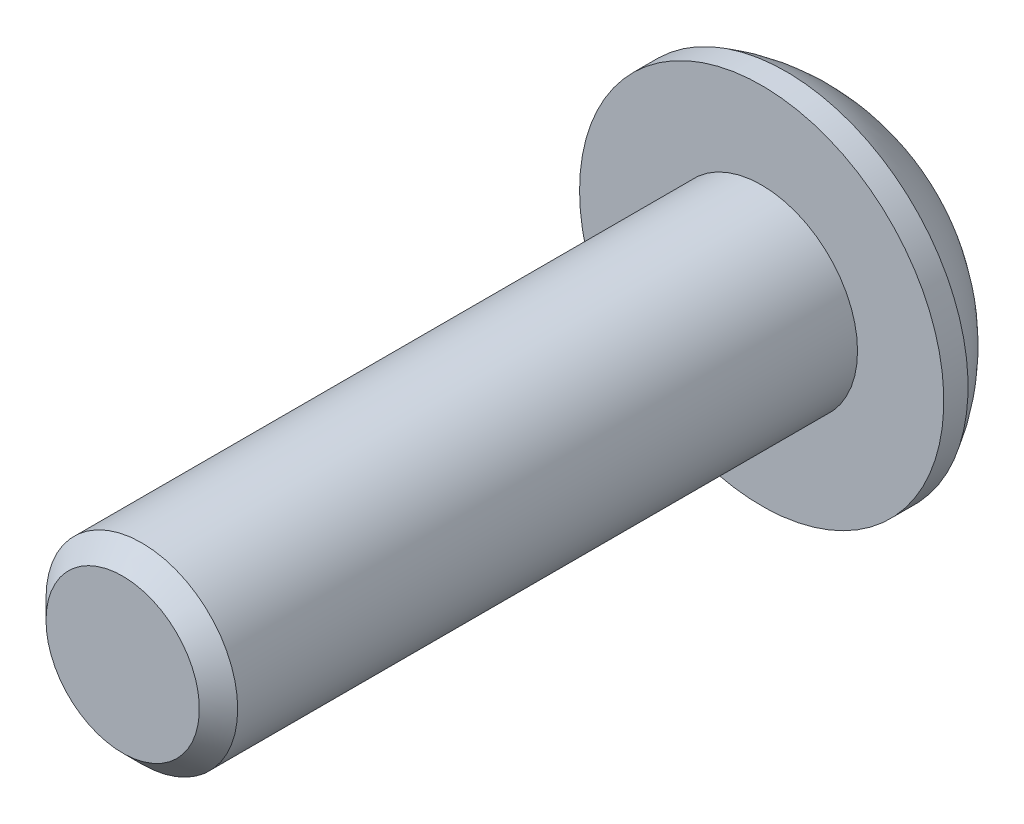
ISO-10303-21;
HEADER;
FILE_DESCRIPTION(('STEP AP214'),'2;1');
FILE_NAME('part.step','',(''),(''),'','','');
FILE_SCHEMA(('AUTOMOTIVE_DESIGN { 1 0 10303 214 1 1 1 1 }'));
ENDSEC;
DATA;
#1=APPLICATION_CONTEXT('core data for automotive mechanical design processes');
#2=APPLICATION_PROTOCOL_DEFINITION('international standard','automotive_design',2000,#1);
#3=PRODUCT_CONTEXT('',#1,'mechanical');
#4=PRODUCT('Part','Part','',(#3));
#5=PRODUCT_RELATED_PRODUCT_CATEGORY('part','',(#4));
#6=PRODUCT_DEFINITION_FORMATION('','',#4);
#7=PRODUCT_DEFINITION_CONTEXT('part definition',#1,'design');
#8=PRODUCT_DEFINITION('design','',#6,#7);
#9=PRODUCT_DEFINITION_SHAPE('','',#8);
#10=(LENGTH_UNIT() NAMED_UNIT(*) SI_UNIT(.MILLI.,.METRE.));
#11=(NAMED_UNIT(*) PLANE_ANGLE_UNIT() SI_UNIT($,.RADIAN.));
#12=(NAMED_UNIT(*) SI_UNIT($,.STERADIAN.) SOLID_ANGLE_UNIT());
#13=UNCERTAINTY_MEASURE_WITH_UNIT(LENGTH_MEASURE(1.E-05),#10,'distance_accuracy_value','');
#14=(GEOMETRIC_REPRESENTATION_CONTEXT(3) GLOBAL_UNCERTAINTY_ASSIGNED_CONTEXT((#13)) GLOBAL_UNIT_ASSIGNED_CONTEXT((#10,
#11,#12)) REPRESENTATION_CONTEXT('',''));
#15=CARTESIAN_POINT('',(0.,0.,0.));
#16=DIRECTION('',(0.,0.,1.));
#17=DIRECTION('',(1.,0.,0.));
#18=AXIS2_PLACEMENT_3D('',#15,#16,#17);
#19=CARTESIAN_POINT('',(0.,0.,-0.84));
#20=DIRECTION('',(0.,0.,1.));
#21=DIRECTION('',(1.,0.,0.));
#22=AXIS2_PLACEMENT_3D('',#19,#20,#21);
#23=PLANE('',#22);
#24=DIRECTION('',(-0.866025403784439,0.5,0.));
#25=VECTOR('',#24,1.);
#26=CARTESIAN_POINT('',(0.,1.15470053837925,-0.84));
#27=LINE('',#26,#25);
#28=CARTESIAN_POINT('',(0.,1.15470053837925,-0.84));
#29=VERTEX_POINT('',#28);
#30=CARTESIAN_POINT('',(1.,0.577350269189626,-0.84));
#31=VERTEX_POINT('',#30);
#32=EDGE_CURVE('E156',#29,#31,#27,.F.);
#33=ORIENTED_EDGE('',*,*,#32,.T.);
#34=DIRECTION('',(0.,1.,0.));
#35=VECTOR('',#34,1.);
#36=CARTESIAN_POINT('',(1.,0.577350269189626,-0.84));
#37=LINE('',#36,#35);
#38=CARTESIAN_POINT('',(1.,-0.577350269189626,-0.84));
#39=VERTEX_POINT('',#38);
#40=EDGE_CURVE('E68',#31,#39,#37,.F.);
#41=ORIENTED_EDGE('',*,*,#40,.T.);
#42=DIRECTION('',(0.866025403784439,0.499999999999999,0.));
#43=VECTOR('',#42,1.);
#44=CARTESIAN_POINT('',(1.,-0.577350269189626,-0.84));
#45=LINE('',#44,#43);
#46=CARTESIAN_POINT('',(0.,-1.15470053837925,-0.84));
#47=VERTEX_POINT('',#46);
#48=EDGE_CURVE('E70',#39,#47,#45,.F.);
#49=ORIENTED_EDGE('',*,*,#48,.T.);
#50=DIRECTION('',(0.866025403784438,-0.5,0.));
#51=VECTOR('',#50,1.);
#52=CARTESIAN_POINT('',(0.,-1.15470053837925,-0.84));
#53=LINE('',#52,#51);
#54=CARTESIAN_POINT('',(-1.,-0.577350269189625,-0.84));
#55=VERTEX_POINT('',#54);
#56=EDGE_CURVE('E72',#47,#55,#53,.F.);
#57=ORIENTED_EDGE('',*,*,#56,.T.);
#58=DIRECTION('',(0.,1.,0.));
#59=VECTOR('',#58,1.);
#60=CARTESIAN_POINT('',(-1.,-0.577350269189626,-0.84));
#61=LINE('',#60,#59);
#62=CARTESIAN_POINT('',(-1.,0.577350269189626,-0.84));
#63=VERTEX_POINT('',#62);
#64=EDGE_CURVE('E144',#55,#63,#61,.T.);
#65=ORIENTED_EDGE('',*,*,#64,.T.);
#66=DIRECTION('',(-0.866025403784439,-0.5,0.));
#67=VECTOR('',#66,1.);
#68=CARTESIAN_POINT('',(-1.,0.577350269189626,-0.84));
#69=LINE('',#68,#67);
#70=EDGE_CURVE('E151',#63,#29,#69,.F.);
#71=ORIENTED_EDGE('',*,*,#70,.T.);
#72=EDGE_LOOP('',(#33,#41,#49,#57,#65,#71));
#73=FACE_BOUND('',#72,.T.);
#74=ADVANCED_FACE('F16',(#73),#23,.F.);
#75=CARTESIAN_POINT('',(0.,-1.15470053837925,-1.65));
#76=DIRECTION('',(-0.5,-0.866025403784438,0.));
#77=DIRECTION('',(0.866025403784438,-0.5,0.));
#78=AXIS2_PLACEMENT_3D('',#75,#76,#77);
#79=PLANE('',#78);
#80=ORIENTED_EDGE('',*,*,#56,.F.);
#81=DIRECTION('',(0.,0.,1.));
#82=VECTOR('',#81,1.);
#83=CARTESIAN_POINT('',(0.,-1.15470053837925,-1.65));
#84=LINE('',#83,#82);
#85=CARTESIAN_POINT('',(0.,-1.15470053837925,-1.65));
#86=VERTEX_POINT('',#85);
#87=EDGE_CURVE('E78',#47,#86,#84,.F.);
#88=ORIENTED_EDGE('',*,*,#87,.T.);
#89=DIRECTION('',(0.866025403784439,-0.499999999999999,0.));
#90=VECTOR('',#89,1.);
#91=CARTESIAN_POINT('',(-1.,-0.577350269189626,-1.65));
#92=LINE('',#91,#90);
#93=CARTESIAN_POINT('',(-1.,-0.577350269189625,-1.65));
#94=VERTEX_POINT('',#93);
#95=EDGE_CURVE('E139',#94,#86,#92,.T.);
#96=ORIENTED_EDGE('',*,*,#95,.F.);
#97=DIRECTION('',(0.,0.,1.));
#98=VECTOR('',#97,1.);
#99=CARTESIAN_POINT('',(-1.,-0.577350269189626,-1.65));
#100=LINE('',#99,#98);
#101=EDGE_CURVE('E84',#94,#55,#100,.T.);
#102=ORIENTED_EDGE('',*,*,#101,.T.);
#103=EDGE_LOOP('',(#80,#88,#96,#102));
#104=FACE_BOUND('',#103,.T.);
#105=ADVANCED_FACE('F81',(#104),#79,.F.);
#106=CARTESIAN_POINT('',(1.,-0.577350269189626,-1.65));
#107=DIRECTION('',(0.499999999999999,-0.866025403784439,0.));
#108=DIRECTION('',(0.866025403784439,0.499999999999999,0.));
#109=AXIS2_PLACEMENT_3D('',#106,#107,#108);
#110=PLANE('',#109);
#111=ORIENTED_EDGE('',*,*,#48,.F.);
#112=DIRECTION('',(0.,0.,-1.));
#113=VECTOR('',#112,1.);
#114=CARTESIAN_POINT('',(1.,-0.577350269189626,-1.65));
#115=LINE('',#114,#113);
#116=CARTESIAN_POINT('',(1.,-0.577350269189626,-1.65));
#117=VERTEX_POINT('',#116);
#118=EDGE_CURVE('E98',#39,#117,#115,.T.);
#119=ORIENTED_EDGE('',*,*,#118,.T.);
#120=DIRECTION('',(0.866025403784439,0.499999999999998,0.));
#121=VECTOR('',#120,1.);
#122=CARTESIAN_POINT('',(0.,-1.15470053837925,-1.65));
#123=LINE('',#122,#121);
#124=EDGE_CURVE('E90',#86,#117,#123,.T.);
#125=ORIENTED_EDGE('',*,*,#124,.F.);
#126=ORIENTED_EDGE('',*,*,#87,.F.);
#127=EDGE_LOOP('',(#111,#119,#125,#126));
#128=FACE_BOUND('',#127,.T.);
#129=ADVANCED_FACE('F88',(#128),#110,.F.);
#130=CARTESIAN_POINT('',(1.,0.577350269189626,-1.65));
#131=DIRECTION('',(1.,0.,0.));
#132=DIRECTION('',(0.,0.,-1.));
#133=AXIS2_PLACEMENT_3D('',#130,#131,#132);
#134=PLANE('',#133);
#135=ORIENTED_EDGE('',*,*,#40,.F.);
#136=DIRECTION('',(0.,0.,1.));
#137=VECTOR('',#136,1.);
#138=CARTESIAN_POINT('',(1.,0.577350269189625,-1.65));
#139=LINE('',#138,#137);
#140=CARTESIAN_POINT('',(1.,0.577350269189626,-1.65));
#141=VERTEX_POINT('',#140);
#142=EDGE_CURVE('E154',#31,#141,#139,.F.);
#143=ORIENTED_EDGE('',*,*,#142,.T.);
#144=DIRECTION('',(0.,1.,0.));
#145=VECTOR('',#144,1.);
#146=CARTESIAN_POINT('',(1.,-0.7125,-1.65));
#147=LINE('',#146,#145);
#148=EDGE_CURVE('E133',#117,#141,#147,.T.);
#149=ORIENTED_EDGE('',*,*,#148,.F.);
#150=ORIENTED_EDGE('',*,*,#118,.F.);
#151=EDGE_LOOP('',(#135,#143,#149,#150));
#152=FACE_BOUND('',#151,.T.);
#153=ADVANCED_FACE('F160',(#152),#134,.F.);
#154=CARTESIAN_POINT('',(0.,1.15470053837925,-1.65));
#155=DIRECTION('',(0.5,0.866025403784439,0.));
#156=DIRECTION('',(-0.866025403784439,0.5,0.));
#157=AXIS2_PLACEMENT_3D('',#154,#155,#156);
#158=PLANE('',#157);
#159=ORIENTED_EDGE('',*,*,#32,.F.);
#160=DIRECTION('',(0.,0.,1.));
#161=VECTOR('',#160,1.);
#162=CARTESIAN_POINT('',(0.,1.15470053837925,-1.65));
#163=LINE('',#162,#161);
#164=CARTESIAN_POINT('',(0.,1.15470053837925,-1.65));
#165=VERTEX_POINT('',#164);
#166=EDGE_CURVE('E148',#29,#165,#163,.F.);
#167=ORIENTED_EDGE('',*,*,#166,.T.);
#168=DIRECTION('',(-0.866025403784439,0.499999999999999,0.));
#169=VECTOR('',#168,1.);
#170=CARTESIAN_POINT('',(1.,0.577350269189626,-1.65));
#171=LINE('',#170,#169);
#172=EDGE_CURVE('E129',#141,#165,#171,.T.);
#173=ORIENTED_EDGE('',*,*,#172,.F.);
#174=ORIENTED_EDGE('',*,*,#142,.F.);
#175=EDGE_LOOP('',(#159,#167,#173,#174));
#176=FACE_BOUND('',#175,.T.);
#177=ADVANCED_FACE('F172',(#176),#158,.F.);
#178=CARTESIAN_POINT('',(-1.,0.577350269189626,-1.65));
#179=DIRECTION('',(-0.5,0.866025403784439,0.));
#180=DIRECTION('',(-0.866025403784439,-0.5,0.));
#181=AXIS2_PLACEMENT_3D('',#178,#179,#180);
#182=PLANE('',#181);
#183=ORIENTED_EDGE('',*,*,#70,.F.);
#184=DIRECTION('',(0.,0.,1.));
#185=VECTOR('',#184,1.);
#186=CARTESIAN_POINT('',(-1.,0.577350269189626,-1.65));
#187=LINE('',#186,#185);
#188=CARTESIAN_POINT('',(-1.,0.577350269189626,-1.65));
#189=VERTEX_POINT('',#188);
#190=EDGE_CURVE('E35',#63,#189,#187,.F.);
#191=ORIENTED_EDGE('',*,*,#190,.T.);
#192=DIRECTION('',(-0.866025403784439,-0.499999999999999,0.));
#193=VECTOR('',#192,1.);
#194=CARTESIAN_POINT('',(0.,1.15470053837925,-1.65));
#195=LINE('',#194,#193);
#196=EDGE_CURVE('E125',#165,#189,#195,.T.);
#197=ORIENTED_EDGE('',*,*,#196,.F.);
#198=ORIENTED_EDGE('',*,*,#166,.F.);
#199=EDGE_LOOP('',(#183,#191,#197,#198));
#200=FACE_BOUND('',#199,.T.);
#201=ADVANCED_FACE('F170',(#200),#182,.F.);
#202=CARTESIAN_POINT('',(-1.,-0.577350269189626,-1.65));
#203=DIRECTION('',(-1.,0.,0.));
#204=DIRECTION('',(0.,0.,1.));
#205=AXIS2_PLACEMENT_3D('',#202,#203,#204);
#206=PLANE('',#205);
#207=ORIENTED_EDGE('',*,*,#64,.F.);
#208=ORIENTED_EDGE('',*,*,#101,.F.);
#209=DIRECTION('',(0.,1.,0.));
#210=VECTOR('',#209,1.);
#211=CARTESIAN_POINT('',(-1.,-0.7125,-1.65));
#212=LINE('',#211,#210);
#213=EDGE_CURVE('E119',#189,#94,#212,.F.);
#214=ORIENTED_EDGE('',*,*,#213,.F.);
#215=ORIENTED_EDGE('',*,*,#190,.F.);
#216=EDGE_LOOP('',(#207,#208,#214,#215));
#217=FACE_BOUND('',#216,.T.);
#218=ADVANCED_FACE('F167',(#217),#206,.F.);
#219=CARTESIAN_POINT('',(0.,-0.7125,-1.65));
#220=DIRECTION('',(0.,0.,-1.));
#221=DIRECTION('',(-1.,0.,0.));
#222=AXIS2_PLACEMENT_3D('',#219,#220,#221);
#223=PLANE('',#222);
#224=ORIENTED_EDGE('',*,*,#196,.T.);
#225=ORIENTED_EDGE('',*,*,#213,.T.);
#226=ORIENTED_EDGE('',*,*,#95,.T.);
#227=ORIENTED_EDGE('',*,*,#124,.T.);
#228=ORIENTED_EDGE('',*,*,#148,.T.);
#229=ORIENTED_EDGE('',*,*,#172,.T.);
#230=EDGE_LOOP('',(#224,#225,#226,#227,#228,#229));
#231=FACE_BOUND('',#230,.T.);
#232=CARTESIAN_POINT('',(0.,0.,-1.65));
#233=DIRECTION('',(0.,0.,-1.));
#234=DIRECTION('',(-1.,0.,0.));
#235=AXIS2_PLACEMENT_3D('',#232,#233,#234);
#236=CIRCLE('',#235,1.425);
#237=CARTESIAN_POINT('',(-1.425,0.,-1.65));
#238=VERTEX_POINT('',#237);
#239=EDGE_CURVE('E19',#238,#238,#236,.F.);
#240=ORIENTED_EDGE('',*,*,#239,.F.);
#241=EDGE_LOOP('',(#240));
#242=FACE_BOUND('',#241,.T.);
#243=ADVANCED_FACE('F164',(#231,#242),#223,.T.);
#244=CARTESIAN_POINT('',(0.,0.,1.02727559055118));
#245=DIRECTION('',(0.,0.,-1.));
#246=DIRECTION('',(0.,-1.,0.));
#247=AXIS2_PLACEMENT_3D('',#244,#245,#246);
#248=DEGENERATE_TOROIDAL_SURFACE('',#247,0.317366666666667,2.89735330756749,.T.);
#249=CARTESIAN_POINT('',(0.,0.,-0.380000000000001));
#250=DIRECTION('',(0.,0.,-1.));
#251=DIRECTION('',(-1.,0.,0.));
#252=AXIS2_PLACEMENT_3D('',#249,#250,#251);
#253=CIRCLE('',#252,2.85);
#254=CARTESIAN_POINT('',(-2.85,0.,-0.380000000000001));
#255=VERTEX_POINT('',#254);
#256=EDGE_CURVE('E108',#255,#255,#253,.F.);
#257=ORIENTED_EDGE('',*,*,#256,.F.);
#258=EDGE_LOOP('',(#257));
#259=FACE_BOUND('',#258,.T.);
#260=ORIENTED_EDGE('',*,*,#239,.T.);
#261=EDGE_LOOP('',(#260));
#262=FACE_BOUND('',#261,.T.);
#263=ADVANCED_FACE('F203',(#259,#262),#248,.T.);
#264=CARTESIAN_POINT('',(0.,0.,10.));
#265=DIRECTION('',(0.,0.,1.));
#266=DIRECTION('',(1.,0.,0.));
#267=AXIS2_PLACEMENT_3D('',#264,#265,#266);
#268=PLANE('',#267);
#269=CARTESIAN_POINT('',(0.,0.,9.99999999999091));
#270=DIRECTION('',(0.,0.,-1.));
#271=DIRECTION('',(-1.,0.,0.));
#272=AXIS2_PLACEMENT_3D('',#269,#270,#271);
#273=CIRCLE('',#272,1.19999999998299);
#274=CARTESIAN_POINT('',(-1.19999999998299,0.,9.99999999999091));
#275=VERTEX_POINT('',#274);
#276=EDGE_CURVE('E105',#275,#275,#273,.T.);
#277=ORIENTED_EDGE('',*,*,#276,.F.);
#278=EDGE_LOOP('',(#277));
#279=FACE_BOUND('',#278,.T.);
#280=ADVANCED_FACE('F199',(#279),#268,.T.);
#281=CARTESIAN_POINT('',(0.,0.,-0.19));
#282=DIRECTION('',(0.,0.,-1.));
#283=DIRECTION('',(-1.,0.,0.));
#284=AXIS2_PLACEMENT_3D('',#281,#282,#283);
#285=CYLINDRICAL_SURFACE('',#284,2.85);
#286=CARTESIAN_POINT('',(0.,0.,0.));
#287=DIRECTION('',(0.,0.,-1.));
#288=DIRECTION('',(-1.,0.,0.));
#289=AXIS2_PLACEMENT_3D('',#286,#287,#288);
#290=CIRCLE('',#289,2.85);
#291=CARTESIAN_POINT('',(-2.85,0.,0.));
#292=VERTEX_POINT('',#291);
#293=EDGE_CURVE('E102',#292,#292,#290,.T.);
#294=ORIENTED_EDGE('',*,*,#293,.T.);
#295=EDGE_LOOP('',(#294));
#296=FACE_BOUND('',#295,.T.);
#297=ORIENTED_EDGE('',*,*,#256,.T.);
#298=EDGE_LOOP('',(#297));
#299=FACE_BOUND('',#298,.T.);
#300=ADVANCED_FACE('F195',(#296,#299),#285,.T.);
#301=CARTESIAN_POINT('',(0.,0.,9.70000000000937));
#302=DIRECTION('',(0.,0.,-1.));
#303=DIRECTION('',(-1.,0.,0.));
#304=AXIS2_PLACEMENT_3D('',#301,#302,#303);
#305=CONICAL_SURFACE('',#304,1.49999999996453,0.785398163397448);
#306=CARTESIAN_POINT('',(0.,0.,9.7));
#307=DIRECTION('',(0.,0.,1.));
#308=DIRECTION('',(1.,0.,0.));
#309=AXIS2_PLACEMENT_3D('',#306,#307,#308);
#310=CIRCLE('',#309,1.5);
#311=CARTESIAN_POINT('',(1.5,0.,9.7));
#312=VERTEX_POINT('',#311);
#313=EDGE_CURVE('E26',#312,#312,#310,.F.);
#314=ORIENTED_EDGE('',*,*,#313,.F.);
#315=EDGE_LOOP('',(#314));
#316=FACE_BOUND('',#315,.T.);
#317=ORIENTED_EDGE('',*,*,#276,.T.);
#318=EDGE_LOOP('',(#317));
#319=FACE_BOUND('',#318,.T.);
#320=ADVANCED_FACE('F188',(#316,#319),#305,.T.);
#321=CARTESIAN_POINT('',(0.,-1.425,0.));
#322=DIRECTION('',(0.,0.,-1.));
#323=DIRECTION('',(-1.,0.,0.));
#324=AXIS2_PLACEMENT_3D('',#321,#322,#323);
#325=PLANE('',#324);
#326=CARTESIAN_POINT('',(0.,0.,0.));
#327=DIRECTION('',(0.,0.,1.));
#328=DIRECTION('',(1.,0.,0.));
#329=AXIS2_PLACEMENT_3D('',#326,#327,#328);
#330=CIRCLE('',#329,1.5);
#331=CARTESIAN_POINT('',(1.5,0.,0.));
#332=VERTEX_POINT('',#331);
#333=EDGE_CURVE('E11',#332,#332,#330,.T.);
#334=ORIENTED_EDGE('',*,*,#333,.F.);
#335=EDGE_LOOP('',(#334));
#336=FACE_BOUND('',#335,.T.);
#337=ORIENTED_EDGE('',*,*,#293,.F.);
#338=EDGE_LOOP('',(#337));
#339=FACE_BOUND('',#338,.T.);
#340=ADVANCED_FACE('F183',(#336,#339),#325,.F.);
#341=CARTESIAN_POINT('',(0.,0.,0.));
#342=DIRECTION('',(0.,0.,1.));
#343=DIRECTION('',(1.,0.,0.));
#344=AXIS2_PLACEMENT_3D('',#341,#342,#343);
#345=CYLINDRICAL_SURFACE('',#344,1.5);
#346=ORIENTED_EDGE('',*,*,#333,.T.);
#347=EDGE_LOOP('',(#346));
#348=FACE_BOUND('',#347,.T.);
#349=ORIENTED_EDGE('',*,*,#313,.T.);
#350=EDGE_LOOP('',(#349));
#351=FACE_BOUND('',#350,.T.);
#352=ADVANCED_FACE('F181',(#348,#351),#345,.T.);
#353=CLOSED_SHELL('',(#74,#105,#129,#153,#177,#201,#218,#243,#263,#280,#300,#320,#340,#352));
#354=MANIFOLD_SOLID_BREP('B1',#353);
#355=ADVANCED_BREP_SHAPE_REPRESENTATION('',(#18,#354),#14);
#356=SHAPE_DEFINITION_REPRESENTATION(#9,#355);
ENDSEC;
END-ISO-10303-21;
